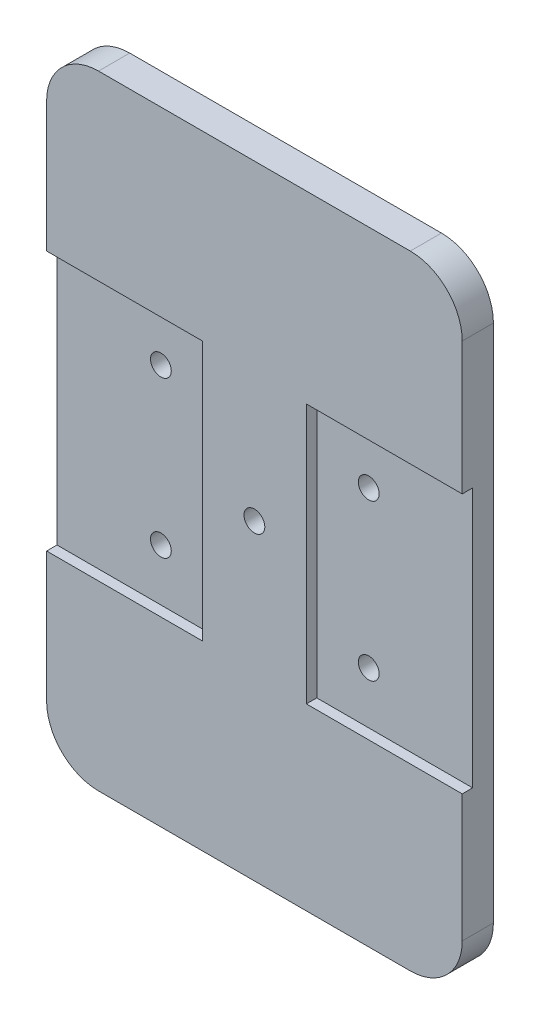
ISO-10303-21;
HEADER;
FILE_DESCRIPTION(('STEP AP214'),'2;1');
FILE_NAME('part.step','',(''),(''),'','','');
FILE_SCHEMA(('AUTOMOTIVE_DESIGN { 1 0 10303 214 1 1 1 1 }'));
ENDSEC;
DATA;
#1=APPLICATION_CONTEXT('core data for automotive mechanical design processes');
#2=APPLICATION_PROTOCOL_DEFINITION('international standard','automotive_design',2000,#1);
#3=PRODUCT_CONTEXT('',#1,'mechanical');
#4=PRODUCT('Part','Part','',(#3));
#5=PRODUCT_RELATED_PRODUCT_CATEGORY('part','',(#4));
#6=PRODUCT_DEFINITION_FORMATION('','',#4);
#7=PRODUCT_DEFINITION_CONTEXT('part definition',#1,'design');
#8=PRODUCT_DEFINITION('design','',#6,#7);
#9=PRODUCT_DEFINITION_SHAPE('','',#8);
#10=(LENGTH_UNIT() NAMED_UNIT(*) SI_UNIT(.MILLI.,.METRE.));
#11=(NAMED_UNIT(*) PLANE_ANGLE_UNIT() SI_UNIT($,.RADIAN.));
#12=(NAMED_UNIT(*) SI_UNIT($,.STERADIAN.) SOLID_ANGLE_UNIT());
#13=UNCERTAINTY_MEASURE_WITH_UNIT(LENGTH_MEASURE(1.E-05),#10,'distance_accuracy_value','');
#14=(GEOMETRIC_REPRESENTATION_CONTEXT(3) GLOBAL_UNCERTAINTY_ASSIGNED_CONTEXT((#13)) GLOBAL_UNIT_ASSIGNED_CONTEXT((#10,
#11,#12)) REPRESENTATION_CONTEXT('',''));
#15=CARTESIAN_POINT('',(0.,0.,0.));
#16=DIRECTION('',(0.,0.,1.));
#17=DIRECTION('',(1.,0.,0.));
#18=AXIS2_PLACEMENT_3D('',#15,#16,#17);
#19=CARTESIAN_POINT('',(-25.9850692997892,26.8064344030394,-3.));
#20=DIRECTION('',(-1.,0.,0.));
#21=DIRECTION('',(0.,-1.,0.));
#22=AXIS2_PLACEMENT_3D('',#19,#20,#21);
#23=PLANE('',#22);
#24=DIRECTION('',(0.,0.,1.));
#25=VECTOR('',#24,1.);
#26=CARTESIAN_POINT('',(-25.9850692997892,-15.9366123004794,-1.));
#27=LINE('',#26,#25);
#28=CARTESIAN_POINT('',(-25.9850692997892,-15.9366123004794,-1.));
#29=VERTEX_POINT('',#28);
#30=CARTESIAN_POINT('',(-25.9850692997892,-15.9366123004794,0.));
#31=VERTEX_POINT('',#30);
#32=EDGE_CURVE('E173',#29,#31,#27,.T.);
#33=ORIENTED_EDGE('',*,*,#32,.T.);
#34=DIRECTION('',(0.,-1.,0.));
#35=VECTOR('',#34,1.);
#36=CARTESIAN_POINT('',(-25.9850692997892,26.8064344030394,0.));
#37=LINE('',#36,#35);
#38=CARTESIAN_POINT('',(-25.9850692997892,-28.1935655969606,0.));
#39=VERTEX_POINT('',#38);
#40=EDGE_CURVE('E296',#31,#39,#37,.T.);
#41=ORIENTED_EDGE('',*,*,#40,.T.);
#42=DIRECTION('',(0.,0.,1.));
#43=VECTOR('',#42,1.);
#44=CARTESIAN_POINT('',(-25.9850692997892,-28.1935655969606,-3.));
#45=LINE('',#44,#43);
#46=CARTESIAN_POINT('',(-25.9850692997892,-28.1935655969606,-3.));
#47=VERTEX_POINT('',#46);
#48=EDGE_CURVE('E292',#39,#47,#45,.F.);
#49=ORIENTED_EDGE('',*,*,#48,.T.);
#50=DIRECTION('',(0.,-1.,0.));
#51=VECTOR('',#50,1.);
#52=CARTESIAN_POINT('',(-25.9850692997892,26.8064344030394,-3.));
#53=LINE('',#52,#51);
#54=CARTESIAN_POINT('',(-25.9850692997892,21.8064344030394,-3.));
#55=VERTEX_POINT('',#54);
#56=EDGE_CURVE('E280',#55,#47,#53,.T.);
#57=ORIENTED_EDGE('',*,*,#56,.F.);
#58=DIRECTION('',(0.,0.,1.));
#59=VECTOR('',#58,1.);
#60=CARTESIAN_POINT('',(-25.9850692997892,21.8064344030394,-3.));
#61=LINE('',#60,#59);
#62=CARTESIAN_POINT('',(-25.9850692997892,21.8064344030394,0.));
#63=VERTEX_POINT('',#62);
#64=EDGE_CURVE('E310',#55,#63,#61,.T.);
#65=ORIENTED_EDGE('',*,*,#64,.T.);
#66=CARTESIAN_POINT('',(-25.9850692997892,9.06338769952061,0.));
#67=VERTEX_POINT('',#66);
#68=EDGE_CURVE('E297',#63,#67,#37,.T.);
#69=ORIENTED_EDGE('',*,*,#68,.T.);
#70=DIRECTION('',(0.,0.,1.));
#71=VECTOR('',#70,1.);
#72=CARTESIAN_POINT('',(-25.9850692997892,9.06338769952061,-1.));
#73=LINE('',#72,#71);
#74=CARTESIAN_POINT('',(-25.9850692997892,9.06338769952061,-1.));
#75=VERTEX_POINT('',#74);
#76=EDGE_CURVE('E66',#75,#67,#73,.T.);
#77=ORIENTED_EDGE('',*,*,#76,.F.);
#78=DIRECTION('',(0.,-1.,0.));
#79=VECTOR('',#78,1.);
#80=CARTESIAN_POINT('',(-25.9850692997892,9.06338769952061,-1.));
#81=LINE('',#80,#79);
#82=EDGE_CURVE('E197',#75,#29,#81,.T.);
#83=ORIENTED_EDGE('',*,*,#82,.T.);
#84=EDGE_LOOP('',(#33,#41,#49,#57,#65,#69,#77,#83));
#85=FACE_BOUND('',#84,.T.);
#86=ADVANCED_FACE('F49',(#85),#23,.F.);
#87=CARTESIAN_POINT('',(0.,0.,0.));
#88=DIRECTION('',(0.,0.,-1.));
#89=DIRECTION('',(-1.,0.,0.));
#90=AXIS2_PLACEMENT_3D('',#87,#88,#89);
#91=PLANE('',#90);
#92=CARTESIAN_POINT('',(-45.9850692997892,-3.19356559696063,0.));
#93=DIRECTION('',(0.,0.,-1.));
#94=DIRECTION('',(-1.,0.,0.));
#95=AXIS2_PLACEMENT_3D('',#92,#93,#94);
#96=CIRCLE('',#95,0.999999999999998);
#97=CARTESIAN_POINT('',(-46.9850692997892,-3.19356559696063,0.));
#98=VERTEX_POINT('',#97);
#99=EDGE_CURVE('E53',#98,#98,#96,.T.);
#100=ORIENTED_EDGE('',*,*,#99,.T.);
#101=EDGE_LOOP('',(#100));
#102=FACE_BOUND('',#101,.T.);
#103=DIRECTION('',(-1.,0.,0.));
#104=VECTOR('',#103,1.);
#105=CARTESIAN_POINT('',(-25.9850692997892,-15.9366123004794,0.));
#106=LINE('',#105,#104);
#107=CARTESIAN_POINT('',(-40.9850692997892,-15.9366123004794,0.));
#108=VERTEX_POINT('',#107);
#109=EDGE_CURVE('E203',#31,#108,#106,.T.);
#110=ORIENTED_EDGE('',*,*,#109,.T.);
#111=DIRECTION('',(0.,-1.,0.));
#112=VECTOR('',#111,1.);
#113=CARTESIAN_POINT('',(-40.9850692997892,9.0633876995206,0.));
#114=LINE('',#113,#112);
#115=CARTESIAN_POINT('',(-40.9850692997892,9.0633876995206,0.));
#116=VERTEX_POINT('',#115);
#117=EDGE_CURVE('E186',#116,#108,#114,.T.);
#118=ORIENTED_EDGE('',*,*,#117,.F.);
#119=DIRECTION('',(-1.,0.,0.));
#120=VECTOR('',#119,1.);
#121=CARTESIAN_POINT('',(-25.9850692997892,9.06338769952061,0.));
#122=LINE('',#121,#120);
#123=EDGE_CURVE('E179',#67,#116,#122,.T.);
#124=ORIENTED_EDGE('',*,*,#123,.F.);
#125=ORIENTED_EDGE('',*,*,#68,.F.);
#126=CARTESIAN_POINT('',(-30.9850692997892,21.8064344030394,0.));
#127=DIRECTION('',(0.,0.,-1.));
#128=DIRECTION('',(-1.,0.,0.));
#129=AXIS2_PLACEMENT_3D('',#126,#127,#128);
#130=CIRCLE('',#129,5.);
#131=CARTESIAN_POINT('',(-30.9850692997892,26.8064344030394,0.));
#132=VERTEX_POINT('',#131);
#133=EDGE_CURVE('E324',#63,#132,#130,.F.);
#134=ORIENTED_EDGE('',*,*,#133,.T.);
#135=DIRECTION('',(1.,0.,0.));
#136=VECTOR('',#135,1.);
#137=CARTESIAN_POINT('',(-65.9850692997892,26.8064344030394,0.));
#138=LINE('',#137,#136);
#139=CARTESIAN_POINT('',(-60.9850692997892,26.8064344030394,0.));
#140=VERTEX_POINT('',#139);
#141=EDGE_CURVE('E265',#140,#132,#138,.T.);
#142=ORIENTED_EDGE('',*,*,#141,.F.);
#143=CARTESIAN_POINT('',(-60.9850692997892,21.8064344030394,0.));
#144=DIRECTION('',(0.,0.,-1.));
#145=DIRECTION('',(-1.,0.,0.));
#146=AXIS2_PLACEMENT_3D('',#143,#144,#145);
#147=CIRCLE('',#146,5.);
#148=CARTESIAN_POINT('',(-65.9850692997892,21.8064344030394,0.));
#149=VERTEX_POINT('',#148);
#150=EDGE_CURVE('E314',#140,#149,#147,.F.);
#151=ORIENTED_EDGE('',*,*,#150,.T.);
#152=DIRECTION('',(0.,-1.,0.));
#153=VECTOR('',#152,1.);
#154=CARTESIAN_POINT('',(-65.9850692997892,26.8064344030394,0.));
#155=LINE('',#154,#153);
#156=CARTESIAN_POINT('',(-65.9850692997892,9.30643440303937,0.));
#157=VERTEX_POINT('',#156);
#158=EDGE_CURVE('E281',#149,#157,#155,.T.);
#159=ORIENTED_EDGE('',*,*,#158,.T.);
#160=DIRECTION('',(1.,0.,0.));
#161=VECTOR('',#160,1.);
#162=CARTESIAN_POINT('',(-65.9850692997892,9.30643440303937,0.));
#163=LINE('',#162,#161);
#164=CARTESIAN_POINT('',(-50.9850692997892,9.30643440303937,0.));
#165=VERTEX_POINT('',#164);
#166=EDGE_CURVE('E242',#157,#165,#163,.T.);
#167=ORIENTED_EDGE('',*,*,#166,.T.);
#168=DIRECTION('',(0.,-1.,0.));
#169=VECTOR('',#168,1.);
#170=CARTESIAN_POINT('',(-50.9850692997892,9.30643440303937,0.));
#171=LINE('',#170,#169);
#172=CARTESIAN_POINT('',(-50.9850692997892,-15.6935655969606,0.));
#173=VERTEX_POINT('',#172);
#174=EDGE_CURVE('E255',#165,#173,#171,.T.);
#175=ORIENTED_EDGE('',*,*,#174,.T.);
#176=DIRECTION('',(1.,0.,0.));
#177=VECTOR('',#176,1.);
#178=CARTESIAN_POINT('',(-65.9850692997892,-15.6935655969606,0.));
#179=LINE('',#178,#177);
#180=CARTESIAN_POINT('',(-65.9850692997892,-15.6935655969606,0.));
#181=VERTEX_POINT('',#180);
#182=EDGE_CURVE('E233',#181,#173,#179,.T.);
#183=ORIENTED_EDGE('',*,*,#182,.F.);
#184=CARTESIAN_POINT('',(-65.9850692997892,-28.1935655969606,0.));
#185=VERTEX_POINT('',#184);
#186=EDGE_CURVE('E305',#181,#185,#155,.T.);
#187=ORIENTED_EDGE('',*,*,#186,.T.);
#188=CARTESIAN_POINT('',(-60.9850692997892,-28.1935655969606,0.));
#189=DIRECTION('',(0.,0.,-1.));
#190=DIRECTION('',(-1.,0.,0.));
#191=AXIS2_PLACEMENT_3D('',#188,#189,#190);
#192=CIRCLE('',#191,5.);
#193=CARTESIAN_POINT('',(-60.9850692997892,-33.1935655969606,0.));
#194=VERTEX_POINT('',#193);
#195=EDGE_CURVE('E317',#185,#194,#192,.F.);
#196=ORIENTED_EDGE('',*,*,#195,.T.);
#197=DIRECTION('',(1.,0.,0.));
#198=VECTOR('',#197,1.);
#199=CARTESIAN_POINT('',(-65.9850692997892,-33.1935655969606,0.));
#200=LINE('',#199,#198);
#201=CARTESIAN_POINT('',(-30.9850692997892,-33.1935655969606,0.));
#202=VERTEX_POINT('',#201);
#203=EDGE_CURVE('E301',#194,#202,#200,.T.);
#204=ORIENTED_EDGE('',*,*,#203,.T.);
#205=CARTESIAN_POINT('',(-30.9850692997892,-28.1935655969606,0.));
#206=DIRECTION('',(0.,0.,-1.));
#207=DIRECTION('',(-1.,0.,0.));
#208=AXIS2_PLACEMENT_3D('',#205,#206,#207);
#209=CIRCLE('',#208,5.);
#210=EDGE_CURVE('E320',#202,#39,#209,.F.);
#211=ORIENTED_EDGE('',*,*,#210,.T.);
#212=ORIENTED_EDGE('',*,*,#40,.F.);
#213=EDGE_LOOP('',(#110,#118,#124,#125,#134,#142,#151,#159,#167,#175,#183,#187,#196,#204,#211,#212));
#214=FACE_BOUND('',#213,.T.);
#215=ADVANCED_FACE('F368',(#102,#214),#91,.F.);
#216=CARTESIAN_POINT('',(-65.9850692997892,26.8064344030394,-3.));
#217=DIRECTION('',(0.,-1.,0.));
#218=DIRECTION('',(0.,0.,-1.));
#219=AXIS2_PLACEMENT_3D('',#216,#217,#218);
#220=PLANE('',#219);
#221=ORIENTED_EDGE('',*,*,#141,.T.);
#222=DIRECTION('',(0.,0.,1.));
#223=VECTOR('',#222,1.);
#224=CARTESIAN_POINT('',(-30.9850692997892,26.8064344030394,-3.));
#225=LINE('',#224,#223);
#226=CARTESIAN_POINT('',(-30.9850692997892,26.8064344030394,-3.));
#227=VERTEX_POINT('',#226);
#228=EDGE_CURVE('E331',#132,#227,#225,.F.);
#229=ORIENTED_EDGE('',*,*,#228,.T.);
#230=DIRECTION('',(1.,0.,0.));
#231=VECTOR('',#230,1.);
#232=CARTESIAN_POINT('',(-65.9850692997892,26.8064344030394,-3.));
#233=LINE('',#232,#231);
#234=CARTESIAN_POINT('',(-60.9850692997892,26.8064344030394,-3.));
#235=VERTEX_POINT('',#234);
#236=EDGE_CURVE('E276',#235,#227,#233,.T.);
#237=ORIENTED_EDGE('',*,*,#236,.F.);
#238=DIRECTION('',(0.,0.,1.));
#239=VECTOR('',#238,1.);
#240=CARTESIAN_POINT('',(-60.9850692997892,26.8064344030394,0.));
#241=LINE('',#240,#239);
#242=EDGE_CURVE('E327',#235,#140,#241,.T.);
#243=ORIENTED_EDGE('',*,*,#242,.T.);
#244=EDGE_LOOP('',(#221,#229,#237,#243));
#245=FACE_BOUND('',#244,.T.);
#246=ADVANCED_FACE('F365',(#245),#220,.F.);
#247=CARTESIAN_POINT('',(-65.9850692997892,-33.1935655969606,-3.));
#248=DIRECTION('',(0.,-1.,0.));
#249=DIRECTION('',(0.,0.,-1.));
#250=AXIS2_PLACEMENT_3D('',#247,#248,#249);
#251=PLANE('',#250);
#252=DIRECTION('',(1.,0.,0.));
#253=VECTOR('',#252,1.);
#254=CARTESIAN_POINT('',(-65.9850692997892,-33.1935655969606,-3.));
#255=LINE('',#254,#253);
#256=CARTESIAN_POINT('',(-60.9850692997892,-33.1935655969606,-3.));
#257=VERTEX_POINT('',#256);
#258=CARTESIAN_POINT('',(-30.9850692997892,-33.1935655969606,-3.));
#259=VERTEX_POINT('',#258);
#260=EDGE_CURVE('E285',#257,#259,#255,.T.);
#261=ORIENTED_EDGE('',*,*,#260,.T.);
#262=DIRECTION('',(0.,0.,1.));
#263=VECTOR('',#262,1.);
#264=CARTESIAN_POINT('',(-30.9850692997892,-33.1935655969606,0.));
#265=LINE('',#264,#263);
#266=EDGE_CURVE('E348',#259,#202,#265,.T.);
#267=ORIENTED_EDGE('',*,*,#266,.T.);
#268=ORIENTED_EDGE('',*,*,#203,.F.);
#269=DIRECTION('',(0.,0.,1.));
#270=VECTOR('',#269,1.);
#271=CARTESIAN_POINT('',(-60.9850692997892,-33.1935655969606,-3.));
#272=LINE('',#271,#270);
#273=EDGE_CURVE('E345',#194,#257,#272,.F.);
#274=ORIENTED_EDGE('',*,*,#273,.T.);
#275=EDGE_LOOP('',(#261,#267,#268,#274));
#276=FACE_BOUND('',#275,.T.);
#277=ADVANCED_FACE('F383',(#276),#251,.T.);
#278=CARTESIAN_POINT('',(-65.9850692997892,26.8064344030394,-3.));
#279=DIRECTION('',(-1.,0.,0.));
#280=DIRECTION('',(0.,-1.,0.));
#281=AXIS2_PLACEMENT_3D('',#278,#279,#280);
#282=PLANE('',#281);
#283=DIRECTION('',(0.,-1.,0.));
#284=VECTOR('',#283,1.);
#285=CARTESIAN_POINT('',(-65.9850692997892,26.8064344030394,-3.));
#286=LINE('',#285,#284);
#287=CARTESIAN_POINT('',(-65.9850692997892,21.8064344030394,-3.));
#288=VERTEX_POINT('',#287);
#289=CARTESIAN_POINT('',(-65.9850692997892,-28.1935655969606,-3.));
#290=VERTEX_POINT('',#289);
#291=EDGE_CURVE('E289',#288,#290,#286,.T.);
#292=ORIENTED_EDGE('',*,*,#291,.T.);
#293=DIRECTION('',(0.,0.,1.));
#294=VECTOR('',#293,1.);
#295=CARTESIAN_POINT('',(-65.9850692997892,-28.1935655969606,-3.));
#296=LINE('',#295,#294);
#297=EDGE_CURVE('E11',#290,#185,#296,.T.);
#298=ORIENTED_EDGE('',*,*,#297,.T.);
#299=ORIENTED_EDGE('',*,*,#186,.F.);
#300=DIRECTION('',(0.,0.,1.));
#301=VECTOR('',#300,1.);
#302=CARTESIAN_POINT('',(-65.9850692997892,-15.6935655969606,-1.));
#303=LINE('',#302,#301);
#304=CARTESIAN_POINT('',(-65.9850692997892,-15.6935655969606,-1.));
#305=VERTEX_POINT('',#304);
#306=EDGE_CURVE('E262',#305,#181,#303,.T.);
#307=ORIENTED_EDGE('',*,*,#306,.F.);
#308=DIRECTION('',(0.,-1.,0.));
#309=VECTOR('',#308,1.);
#310=CARTESIAN_POINT('',(-65.9850692997892,9.30643440303937,-1.));
#311=LINE('',#310,#309);
#312=CARTESIAN_POINT('',(-65.9850692997892,9.30643440303937,-1.));
#313=VERTEX_POINT('',#312);
#314=EDGE_CURVE('E248',#313,#305,#311,.T.);
#315=ORIENTED_EDGE('',*,*,#314,.F.);
#316=DIRECTION('',(0.,0.,1.));
#317=VECTOR('',#316,1.);
#318=CARTESIAN_POINT('',(-65.9850692997892,9.30643440303937,-1.));
#319=LINE('',#318,#317);
#320=EDGE_CURVE('E266',#313,#157,#319,.T.);
#321=ORIENTED_EDGE('',*,*,#320,.T.);
#322=ORIENTED_EDGE('',*,*,#158,.F.);
#323=DIRECTION('',(0.,0.,1.));
#324=VECTOR('',#323,1.);
#325=CARTESIAN_POINT('',(-65.9850692997892,21.8064344030394,-3.));
#326=LINE('',#325,#324);
#327=EDGE_CURVE('E59',#149,#288,#326,.F.);
#328=ORIENTED_EDGE('',*,*,#327,.T.);
#329=EDGE_LOOP('',(#292,#298,#299,#307,#315,#321,#322,#328));
#330=FACE_BOUND('',#329,.T.);
#331=ADVANCED_FACE('F356',(#330),#282,.T.);
#332=CARTESIAN_POINT('',(0.,0.,-3.));
#333=DIRECTION('',(0.,0.,-1.));
#334=DIRECTION('',(-1.,0.,0.));
#335=AXIS2_PLACEMENT_3D('',#332,#333,#334);
#336=PLANE('',#335);
#337=CARTESIAN_POINT('',(-35.9850692997892,4.06338769952061,-3.));
#338=DIRECTION('',(0.,0.,-1.));
#339=DIRECTION('',(-1.,0.,0.));
#340=AXIS2_PLACEMENT_3D('',#337,#338,#339);
#341=CIRCLE('',#340,0.999999999999998);
#342=CARTESIAN_POINT('',(-36.9850692997892,4.06338769952061,-3.));
#343=VERTEX_POINT('',#342);
#344=EDGE_CURVE('E206',#343,#343,#341,.T.);
#345=ORIENTED_EDGE('',*,*,#344,.F.);
#346=EDGE_LOOP('',(#345));
#347=FACE_BOUND('',#346,.T.);
#348=CARTESIAN_POINT('',(-35.9850692997892,-10.9366123004794,-3.));
#349=DIRECTION('',(0.,0.,-1.));
#350=DIRECTION('',(-1.,0.,0.));
#351=AXIS2_PLACEMENT_3D('',#348,#349,#350);
#352=CIRCLE('',#351,0.999999999999998);
#353=CARTESIAN_POINT('',(-36.9850692997892,-10.9366123004794,-3.));
#354=VERTEX_POINT('',#353);
#355=EDGE_CURVE('E512',#354,#354,#352,.T.);
#356=ORIENTED_EDGE('',*,*,#355,.F.);
#357=EDGE_LOOP('',(#356));
#358=FACE_BOUND('',#357,.T.);
#359=CARTESIAN_POINT('',(-45.9850692997892,-3.19356559696063,-3.));
#360=DIRECTION('',(0.,0.,-1.));
#361=DIRECTION('',(-1.,0.,0.));
#362=AXIS2_PLACEMENT_3D('',#359,#360,#361);
#363=CIRCLE('',#362,0.999999999999998);
#364=CARTESIAN_POINT('',(-46.9850692997892,-3.19356559696063,-3.));
#365=VERTEX_POINT('',#364);
#366=EDGE_CURVE('E189',#365,#365,#363,.T.);
#367=ORIENTED_EDGE('',*,*,#366,.F.);
#368=EDGE_LOOP('',(#367));
#369=FACE_BOUND('',#368,.T.);
#370=CARTESIAN_POINT('',(-55.9850692997892,-10.6935655969606,-3.));
#371=DIRECTION('',(0.,0.,1.));
#372=DIRECTION('',(1.,0.,0.));
#373=AXIS2_PLACEMENT_3D('',#370,#371,#372);
#374=CIRCLE('',#373,0.999999999999998);
#375=CARTESIAN_POINT('',(-54.9850692997892,-10.6935655969606,-3.));
#376=VERTEX_POINT('',#375);
#377=EDGE_CURVE('E220',#376,#376,#374,.T.);
#378=ORIENTED_EDGE('',*,*,#377,.T.);
#379=EDGE_LOOP('',(#378));
#380=FACE_BOUND('',#379,.T.);
#381=CARTESIAN_POINT('',(-55.9850692997892,4.30643440303937,-3.));
#382=DIRECTION('',(0.,0.,1.));
#383=DIRECTION('',(1.,0.,0.));
#384=AXIS2_PLACEMENT_3D('',#381,#382,#383);
#385=CIRCLE('',#384,0.999999999999998);
#386=CARTESIAN_POINT('',(-54.9850692997892,4.30643440303937,-3.));
#387=VERTEX_POINT('',#386);
#388=EDGE_CURVE('E229',#387,#387,#385,.T.);
#389=ORIENTED_EDGE('',*,*,#388,.T.);
#390=EDGE_LOOP('',(#389));
#391=FACE_BOUND('',#390,.T.);
#392=ORIENTED_EDGE('',*,*,#236,.T.);
#393=CARTESIAN_POINT('',(-30.9850692997892,21.8064344030394,-3.));
#394=DIRECTION('',(0.,0.,-1.));
#395=DIRECTION('',(-1.,0.,0.));
#396=AXIS2_PLACEMENT_3D('',#393,#394,#395);
#397=CIRCLE('',#396,5.);
#398=EDGE_CURVE('E342',#227,#55,#397,.T.);
#399=ORIENTED_EDGE('',*,*,#398,.T.);
#400=ORIENTED_EDGE('',*,*,#56,.T.);
#401=CARTESIAN_POINT('',(-30.9850692997892,-28.1935655969606,-3.));
#402=DIRECTION('',(0.,0.,-1.));
#403=DIRECTION('',(-1.,0.,0.));
#404=AXIS2_PLACEMENT_3D('',#401,#402,#403);
#405=CIRCLE('',#404,5.);
#406=EDGE_CURVE('E339',#47,#259,#405,.T.);
#407=ORIENTED_EDGE('',*,*,#406,.T.);
#408=ORIENTED_EDGE('',*,*,#260,.F.);
#409=CARTESIAN_POINT('',(-60.9850692997892,-28.1935655969606,-3.));
#410=DIRECTION('',(0.,0.,-1.));
#411=DIRECTION('',(-1.,0.,0.));
#412=AXIS2_PLACEMENT_3D('',#409,#410,#411);
#413=CIRCLE('',#412,5.);
#414=EDGE_CURVE('E74',#257,#290,#413,.T.);
#415=ORIENTED_EDGE('',*,*,#414,.T.);
#416=ORIENTED_EDGE('',*,*,#291,.F.);
#417=CARTESIAN_POINT('',(-60.9850692997892,21.8064344030394,-3.));
#418=DIRECTION('',(0.,0.,-1.));
#419=DIRECTION('',(-1.,0.,0.));
#420=AXIS2_PLACEMENT_3D('',#417,#418,#419);
#421=CIRCLE('',#420,5.);
#422=EDGE_CURVE('E334',#288,#235,#421,.T.);
#423=ORIENTED_EDGE('',*,*,#422,.T.);
#424=EDGE_LOOP('',(#392,#399,#400,#407,#408,#415,#416,#423));
#425=FACE_BOUND('',#424,.T.);
#426=ADVANCED_FACE('F360',(#347,#358,#369,#380,#391,#425),#336,.T.);
#427=CARTESIAN_POINT('',(-65.9850692997892,-15.6935655969606,-1.));
#428=DIRECTION('',(0.,-1.,0.));
#429=DIRECTION('',(0.,0.,-1.));
#430=AXIS2_PLACEMENT_3D('',#427,#428,#429);
#431=PLANE('',#430);
#432=ORIENTED_EDGE('',*,*,#182,.T.);
#433=DIRECTION('',(0.,0.,1.));
#434=VECTOR('',#433,1.);
#435=CARTESIAN_POINT('',(-50.9850692997892,-15.6935655969606,-1.));
#436=LINE('',#435,#434);
#437=CARTESIAN_POINT('',(-50.9850692997892,-15.6935655969606,-1.));
#438=VERTEX_POINT('',#437);
#439=EDGE_CURVE('E252',#438,#173,#436,.T.);
#440=ORIENTED_EDGE('',*,*,#439,.F.);
#441=DIRECTION('',(1.,0.,0.));
#442=VECTOR('',#441,1.);
#443=CARTESIAN_POINT('',(-65.9850692997892,-15.6935655969606,-1.));
#444=LINE('',#443,#442);
#445=EDGE_CURVE('E237',#305,#438,#444,.T.);
#446=ORIENTED_EDGE('',*,*,#445,.F.);
#447=ORIENTED_EDGE('',*,*,#306,.T.);
#448=EDGE_LOOP('',(#432,#440,#446,#447));
#449=FACE_BOUND('',#448,.T.);
#450=ADVANCED_FACE('F528',(#449),#431,.F.);
#451=CARTESIAN_POINT('',(-65.9850692997892,9.30643440303937,-1.));
#452=DIRECTION('',(0.,-1.,0.));
#453=DIRECTION('',(0.,0.,-1.));
#454=AXIS2_PLACEMENT_3D('',#451,#452,#453);
#455=PLANE('',#454);
#456=ORIENTED_EDGE('',*,*,#166,.F.);
#457=ORIENTED_EDGE('',*,*,#320,.F.);
#458=DIRECTION('',(1.,0.,0.));
#459=VECTOR('',#458,1.);
#460=CARTESIAN_POINT('',(-65.9850692997892,9.30643440303937,-1.));
#461=LINE('',#460,#459);
#462=CARTESIAN_POINT('',(-50.9850692997892,9.30643440303937,-1.));
#463=VERTEX_POINT('',#462);
#464=EDGE_CURVE('E245',#313,#463,#461,.T.);
#465=ORIENTED_EDGE('',*,*,#464,.T.);
#466=DIRECTION('',(0.,0.,1.));
#467=VECTOR('',#466,1.);
#468=CARTESIAN_POINT('',(-50.9850692997892,9.30643440303937,-1.));
#469=LINE('',#468,#467);
#470=EDGE_CURVE('E270',#463,#165,#469,.T.);
#471=ORIENTED_EDGE('',*,*,#470,.T.);
#472=EDGE_LOOP('',(#456,#457,#465,#471));
#473=FACE_BOUND('',#472,.T.);
#474=ADVANCED_FACE('F558',(#473),#455,.T.);
#475=CARTESIAN_POINT('',(-50.9850692997892,9.30643440303937,-1.));
#476=DIRECTION('',(-1.,0.,0.));
#477=DIRECTION('',(0.,0.,1.));
#478=AXIS2_PLACEMENT_3D('',#475,#476,#477);
#479=PLANE('',#478);
#480=ORIENTED_EDGE('',*,*,#174,.F.);
#481=ORIENTED_EDGE('',*,*,#470,.F.);
#482=DIRECTION('',(0.,-1.,0.));
#483=VECTOR('',#482,1.);
#484=CARTESIAN_POINT('',(-50.9850692997892,9.30643440303937,-1.));
#485=LINE('',#484,#483);
#486=EDGE_CURVE('E241',#463,#438,#485,.T.);
#487=ORIENTED_EDGE('',*,*,#486,.T.);
#488=ORIENTED_EDGE('',*,*,#439,.T.);
#489=EDGE_LOOP('',(#480,#481,#487,#488));
#490=FACE_BOUND('',#489,.T.);
#491=ADVANCED_FACE('F546',(#490),#479,.T.);
#492=CARTESIAN_POINT('',(0.,0.,-1.));
#493=DIRECTION('',(0.,0.,-1.));
#494=DIRECTION('',(-1.,0.,0.));
#495=AXIS2_PLACEMENT_3D('',#492,#493,#494);
#496=PLANE('',#495);
#497=CARTESIAN_POINT('',(-55.9850692997892,-10.6935655969606,-1.));
#498=DIRECTION('',(0.,0.,1.));
#499=DIRECTION('',(1.,0.,0.));
#500=AXIS2_PLACEMENT_3D('',#497,#498,#499);
#501=CIRCLE('',#500,0.999999999999998);
#502=CARTESIAN_POINT('',(-54.9850692997892,-10.6935655969606,-1.));
#503=VERTEX_POINT('',#502);
#504=EDGE_CURVE('E225',#503,#503,#501,.T.);
#505=ORIENTED_EDGE('',*,*,#504,.F.);
#506=EDGE_LOOP('',(#505));
#507=FACE_BOUND('',#506,.T.);
#508=CARTESIAN_POINT('',(-55.9850692997892,4.30643440303937,-1.));
#509=DIRECTION('',(0.,0.,1.));
#510=DIRECTION('',(1.,0.,0.));
#511=AXIS2_PLACEMENT_3D('',#508,#509,#510);
#512=CIRCLE('',#511,0.999999999999998);
#513=CARTESIAN_POINT('',(-54.9850692997892,4.30643440303937,-1.));
#514=VERTEX_POINT('',#513);
#515=EDGE_CURVE('E224',#514,#514,#512,.T.);
#516=ORIENTED_EDGE('',*,*,#515,.F.);
#517=EDGE_LOOP('',(#516));
#518=FACE_BOUND('',#517,.T.);
#519=ORIENTED_EDGE('',*,*,#445,.T.);
#520=ORIENTED_EDGE('',*,*,#486,.F.);
#521=ORIENTED_EDGE('',*,*,#464,.F.);
#522=ORIENTED_EDGE('',*,*,#314,.T.);
#523=EDGE_LOOP('',(#519,#520,#521,#522));
#524=FACE_BOUND('',#523,.T.);
#525=ADVANCED_FACE('F540',(#507,#518,#524),#496,.F.);
#526=CARTESIAN_POINT('',(-55.9850692997892,4.30643440303937,-3.));
#527=DIRECTION('',(0.,0.,1.));
#528=DIRECTION('',(1.,0.,0.));
#529=AXIS2_PLACEMENT_3D('',#526,#527,#528);
#530=CYLINDRICAL_SURFACE('',#529,0.999999999999998);
#531=ORIENTED_EDGE('',*,*,#388,.F.);
#532=EDGE_LOOP('',(#531));
#533=FACE_BOUND('',#532,.T.);
#534=ORIENTED_EDGE('',*,*,#515,.T.);
#535=EDGE_LOOP('',(#534));
#536=FACE_BOUND('',#535,.T.);
#537=ADVANCED_FACE('F537',(#533,#536),#530,.F.);
#538=CARTESIAN_POINT('',(-55.9850692997892,-10.6935655969606,-3.));
#539=DIRECTION('',(0.,0.,1.));
#540=DIRECTION('',(1.,0.,0.));
#541=AXIS2_PLACEMENT_3D('',#538,#539,#540);
#542=CYLINDRICAL_SURFACE('',#541,0.999999999999998);
#543=ORIENTED_EDGE('',*,*,#377,.F.);
#544=EDGE_LOOP('',(#543));
#545=FACE_BOUND('',#544,.T.);
#546=ORIENTED_EDGE('',*,*,#504,.T.);
#547=EDGE_LOOP('',(#546));
#548=FACE_BOUND('',#547,.T.);
#549=ADVANCED_FACE('F423',(#545,#548),#542,.F.);
#550=CARTESIAN_POINT('',(-30.9850692997892,21.8064344030394,-3.));
#551=DIRECTION('',(0.,0.,1.));
#552=DIRECTION('',(1.,0.,0.));
#553=AXIS2_PLACEMENT_3D('',#550,#551,#552);
#554=CYLINDRICAL_SURFACE('',#553,5.);
#555=ORIENTED_EDGE('',*,*,#398,.F.);
#556=ORIENTED_EDGE('',*,*,#228,.F.);
#557=ORIENTED_EDGE('',*,*,#133,.F.);
#558=ORIENTED_EDGE('',*,*,#64,.F.);
#559=EDGE_LOOP('',(#555,#556,#557,#558));
#560=FACE_BOUND('',#559,.T.);
#561=ADVANCED_FACE('F373',(#560),#554,.T.);
#562=CARTESIAN_POINT('',(-30.9850692997892,-28.1935655969606,-3.));
#563=DIRECTION('',(0.,0.,-1.));
#564=DIRECTION('',(-1.,0.,0.));
#565=AXIS2_PLACEMENT_3D('',#562,#563,#564);
#566=CYLINDRICAL_SURFACE('',#565,5.);
#567=ORIENTED_EDGE('',*,*,#406,.F.);
#568=ORIENTED_EDGE('',*,*,#48,.F.);
#569=ORIENTED_EDGE('',*,*,#210,.F.);
#570=ORIENTED_EDGE('',*,*,#266,.F.);
#571=EDGE_LOOP('',(#567,#568,#569,#570));
#572=FACE_BOUND('',#571,.T.);
#573=ADVANCED_FACE('F380',(#572),#566,.T.);
#574=CARTESIAN_POINT('',(-60.9850692997892,-28.1935655969606,-3.));
#575=DIRECTION('',(0.,0.,1.));
#576=DIRECTION('',(1.,0.,0.));
#577=AXIS2_PLACEMENT_3D('',#574,#575,#576);
#578=CYLINDRICAL_SURFACE('',#577,5.);
#579=ORIENTED_EDGE('',*,*,#414,.F.);
#580=ORIENTED_EDGE('',*,*,#273,.F.);
#581=ORIENTED_EDGE('',*,*,#195,.F.);
#582=ORIENTED_EDGE('',*,*,#297,.F.);
#583=EDGE_LOOP('',(#579,#580,#581,#582));
#584=FACE_BOUND('',#583,.T.);
#585=ADVANCED_FACE('F390',(#584),#578,.T.);
#586=CARTESIAN_POINT('',(-60.9850692997892,21.8064344030394,-3.));
#587=DIRECTION('',(0.,0.,-1.));
#588=DIRECTION('',(-1.,0.,0.));
#589=AXIS2_PLACEMENT_3D('',#586,#587,#588);
#590=CYLINDRICAL_SURFACE('',#589,5.);
#591=ORIENTED_EDGE('',*,*,#422,.F.);
#592=ORIENTED_EDGE('',*,*,#327,.F.);
#593=ORIENTED_EDGE('',*,*,#150,.F.);
#594=ORIENTED_EDGE('',*,*,#242,.F.);
#595=EDGE_LOOP('',(#591,#592,#593,#594));
#596=FACE_BOUND('',#595,.T.);
#597=ADVANCED_FACE('F51',(#596),#590,.T.);
#598=CARTESIAN_POINT('',(-45.9850692997892,-3.19356559696063,9.00000000000001));
#599=DIRECTION('',(0.,0.,-1.));
#600=DIRECTION('',(-1.,0.,0.));
#601=AXIS2_PLACEMENT_3D('',#598,#599,#600);
#602=CYLINDRICAL_SURFACE('',#601,0.999999999999998);
#603=ORIENTED_EDGE('',*,*,#366,.T.);
#604=EDGE_LOOP('',(#603));
#605=FACE_BOUND('',#604,.T.);
#606=ORIENTED_EDGE('',*,*,#99,.F.);
#607=EDGE_LOOP('',(#606));
#608=FACE_BOUND('',#607,.T.);
#609=ADVANCED_FACE('F400',(#605,#608),#602,.F.);
#610=CARTESIAN_POINT('',(-25.9850692997892,-15.9366123004794,-1.));
#611=DIRECTION('',(0.,1.,0.));
#612=DIRECTION('',(-1.,0.,0.));
#613=AXIS2_PLACEMENT_3D('',#610,#611,#612);
#614=PLANE('',#613);
#615=ORIENTED_EDGE('',*,*,#109,.F.);
#616=ORIENTED_EDGE('',*,*,#32,.F.);
#617=DIRECTION('',(-1.,0.,0.));
#618=VECTOR('',#617,1.);
#619=CARTESIAN_POINT('',(-25.9850692997892,-15.9366123004794,-1.));
#620=LINE('',#619,#618);
#621=CARTESIAN_POINT('',(-40.9850692997892,-15.9366123004794,-1.));
#622=VERTEX_POINT('',#621);
#623=EDGE_CURVE('E167',#29,#622,#620,.T.);
#624=ORIENTED_EDGE('',*,*,#623,.T.);
#625=DIRECTION('',(0.,0.,1.));
#626=VECTOR('',#625,1.);
#627=CARTESIAN_POINT('',(-40.9850692997892,-15.9366123004794,-1.));
#628=LINE('',#627,#626);
#629=EDGE_CURVE('E170',#622,#108,#628,.T.);
#630=ORIENTED_EDGE('',*,*,#629,.T.);
#631=EDGE_LOOP('',(#615,#616,#624,#630));
#632=FACE_BOUND('',#631,.T.);
#633=ADVANCED_FACE('F169',(#632),#614,.T.);
#634=CARTESIAN_POINT('',(-40.9850692997892,9.0633876995206,-1.));
#635=DIRECTION('',(-1.,0.,0.));
#636=DIRECTION('',(0.,0.,1.));
#637=AXIS2_PLACEMENT_3D('',#634,#635,#636);
#638=PLANE('',#637);
#639=ORIENTED_EDGE('',*,*,#117,.T.);
#640=ORIENTED_EDGE('',*,*,#629,.F.);
#641=DIRECTION('',(0.,-1.,0.));
#642=VECTOR('',#641,1.);
#643=CARTESIAN_POINT('',(-40.9850692997892,9.0633876995206,-1.));
#644=LINE('',#643,#642);
#645=CARTESIAN_POINT('',(-40.9850692997892,9.0633876995206,-1.));
#646=VERTEX_POINT('',#645);
#647=EDGE_CURVE('E178',#646,#622,#644,.T.);
#648=ORIENTED_EDGE('',*,*,#647,.F.);
#649=DIRECTION('',(0.,0.,1.));
#650=VECTOR('',#649,1.);
#651=CARTESIAN_POINT('',(-40.9850692997892,9.0633876995206,-1.));
#652=LINE('',#651,#650);
#653=EDGE_CURVE('E190',#646,#116,#652,.T.);
#654=ORIENTED_EDGE('',*,*,#653,.T.);
#655=EDGE_LOOP('',(#639,#640,#648,#654));
#656=FACE_BOUND('',#655,.T.);
#657=ADVANCED_FACE('F183',(#656),#638,.F.);
#658=CARTESIAN_POINT('',(-25.9850692997892,9.06338769952061,-1.));
#659=DIRECTION('',(0.,1.,0.));
#660=DIRECTION('',(-1.,0.,0.));
#661=AXIS2_PLACEMENT_3D('',#658,#659,#660);
#662=PLANE('',#661);
#663=ORIENTED_EDGE('',*,*,#123,.T.);
#664=ORIENTED_EDGE('',*,*,#653,.F.);
#665=DIRECTION('',(-1.,0.,0.));
#666=VECTOR('',#665,1.);
#667=CARTESIAN_POINT('',(-25.9850692997892,9.06338769952061,-1.));
#668=LINE('',#667,#666);
#669=EDGE_CURVE('E193',#75,#646,#668,.T.);
#670=ORIENTED_EDGE('',*,*,#669,.F.);
#671=ORIENTED_EDGE('',*,*,#76,.T.);
#672=EDGE_LOOP('',(#663,#664,#670,#671));
#673=FACE_BOUND('',#672,.T.);
#674=ADVANCED_FACE('F464',(#673),#662,.F.);
#675=CARTESIAN_POINT('',(0.,0.,-1.));
#676=DIRECTION('',(0.,0.,1.));
#677=DIRECTION('',(1.,0.,0.));
#678=AXIS2_PLACEMENT_3D('',#675,#676,#677);
#679=PLANE('',#678);
#680=CARTESIAN_POINT('',(-35.9850692997892,4.06338769952061,-1.));
#681=DIRECTION('',(0.,0.,1.));
#682=DIRECTION('',(1.,0.,0.));
#683=AXIS2_PLACEMENT_3D('',#680,#681,#682);
#684=CIRCLE('',#683,0.999999999999998);
#685=CARTESIAN_POINT('',(-34.9850692997892,4.06338769952061,-1.));
#686=VERTEX_POINT('',#685);
#687=EDGE_CURVE('E510',#686,#686,#684,.T.);
#688=ORIENTED_EDGE('',*,*,#687,.F.);
#689=EDGE_LOOP('',(#688));
#690=FACE_BOUND('',#689,.T.);
#691=CARTESIAN_POINT('',(-35.9850692997892,-10.9366123004794,-1.));
#692=DIRECTION('',(0.,0.,1.));
#693=DIRECTION('',(1.,0.,0.));
#694=AXIS2_PLACEMENT_3D('',#691,#692,#693);
#695=CIRCLE('',#694,0.999999999999998);
#696=CARTESIAN_POINT('',(-34.9850692997892,-10.9366123004794,-1.));
#697=VERTEX_POINT('',#696);
#698=EDGE_CURVE('E513',#697,#697,#695,.T.);
#699=ORIENTED_EDGE('',*,*,#698,.F.);
#700=EDGE_LOOP('',(#699));
#701=FACE_BOUND('',#700,.T.);
#702=ORIENTED_EDGE('',*,*,#623,.F.);
#703=ORIENTED_EDGE('',*,*,#82,.F.);
#704=ORIENTED_EDGE('',*,*,#669,.T.);
#705=ORIENTED_EDGE('',*,*,#647,.T.);
#706=EDGE_LOOP('',(#702,#703,#704,#705));
#707=FACE_BOUND('',#706,.T.);
#708=ADVANCED_FACE('F192',(#690,#701,#707),#679,.T.);
#709=CARTESIAN_POINT('',(-35.9850692997892,-10.9366123004794,-8.));
#710=DIRECTION('',(0.,0.,1.));
#711=DIRECTION('',(1.,0.,0.));
#712=AXIS2_PLACEMENT_3D('',#709,#710,#711);
#713=CYLINDRICAL_SURFACE('',#712,0.999999999999998);
#714=ORIENTED_EDGE('',*,*,#355,.T.);
#715=EDGE_LOOP('',(#714));
#716=FACE_BOUND('',#715,.T.);
#717=ORIENTED_EDGE('',*,*,#698,.T.);
#718=EDGE_LOOP('',(#717));
#719=FACE_BOUND('',#718,.T.);
#720=ADVANCED_FACE('F482',(#716,#719),#713,.F.);
#721=CARTESIAN_POINT('',(-35.9850692997892,4.06338769952061,-8.));
#722=DIRECTION('',(0.,0.,1.));
#723=DIRECTION('',(1.,0.,0.));
#724=AXIS2_PLACEMENT_3D('',#721,#722,#723);
#725=CYLINDRICAL_SURFACE('',#724,0.999999999999998);
#726=ORIENTED_EDGE('',*,*,#344,.T.);
#727=EDGE_LOOP('',(#726));
#728=FACE_BOUND('',#727,.T.);
#729=ORIENTED_EDGE('',*,*,#687,.T.);
#730=EDGE_LOOP('',(#729));
#731=FACE_BOUND('',#730,.T.);
#732=ADVANCED_FACE('F492',(#728,#731),#725,.F.);
#733=CLOSED_SHELL('',(#86,#215,#246,#277,#331,#426,#450,#474,#491,#525,#537,#549,#561,#573,#585,
#597,#609,#633,#657,#674,#708,#720,#732));
#734=MANIFOLD_SOLID_BREP('B2',#733);
#735=ADVANCED_BREP_SHAPE_REPRESENTATION('',(#18,#734),#14);
#736=SHAPE_DEFINITION_REPRESENTATION(#9,#735);
ENDSEC;
END-ISO-10303-21;
